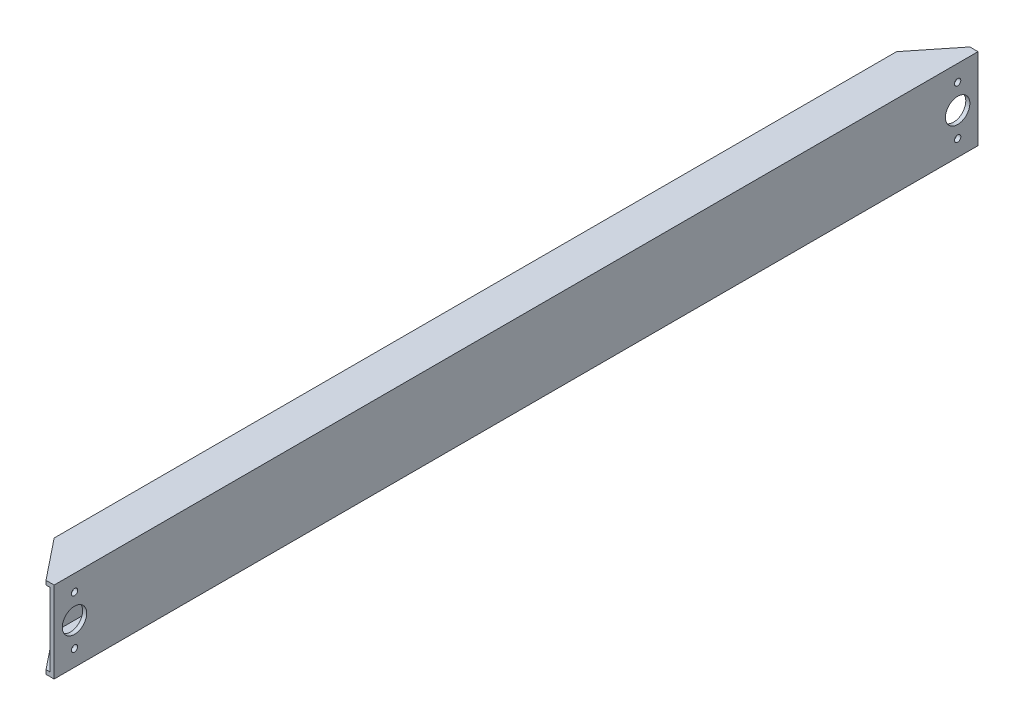
ISO-10303-21;
HEADER;
FILE_DESCRIPTION(('STEP AP214'),'2;1');
FILE_NAME('part.step','',(''),(''),'','','');
FILE_SCHEMA(('AUTOMOTIVE_DESIGN { 1 0 10303 214 1 1 1 1 }'));
ENDSEC;
DATA;
#1=APPLICATION_CONTEXT('core data for automotive mechanical design processes');
#2=APPLICATION_PROTOCOL_DEFINITION('international standard','automotive_design',2000,#1);
#3=PRODUCT_CONTEXT('',#1,'mechanical');
#4=PRODUCT('Part','Part','',(#3));
#5=PRODUCT_RELATED_PRODUCT_CATEGORY('part','',(#4));
#6=PRODUCT_DEFINITION_FORMATION('','',#4);
#7=PRODUCT_DEFINITION_CONTEXT('part definition',#1,'design');
#8=PRODUCT_DEFINITION('design','',#6,#7);
#9=PRODUCT_DEFINITION_SHAPE('','',#8);
#10=(LENGTH_UNIT() NAMED_UNIT(*) SI_UNIT(.MILLI.,.METRE.));
#11=(NAMED_UNIT(*) PLANE_ANGLE_UNIT() SI_UNIT($,.RADIAN.));
#12=(NAMED_UNIT(*) SI_UNIT($,.STERADIAN.) SOLID_ANGLE_UNIT());
#13=UNCERTAINTY_MEASURE_WITH_UNIT(LENGTH_MEASURE(1.E-05),#10,'distance_accuracy_value','');
#14=(GEOMETRIC_REPRESENTATION_CONTEXT(3) GLOBAL_UNCERTAINTY_ASSIGNED_CONTEXT((#13)) GLOBAL_UNIT_ASSIGNED_CONTEXT((#10,
#11,#12)) REPRESENTATION_CONTEXT('',''));
#15=CARTESIAN_POINT('',(0.,0.,0.));
#16=DIRECTION('',(0.,0.,1.));
#17=DIRECTION('',(1.,0.,0.));
#18=AXIS2_PLACEMENT_3D('',#15,#16,#17);
#19=CARTESIAN_POINT('',(0.,0.,0.));
#20=DIRECTION('',(0.,0.,1.));
#21=DIRECTION('',(1.,0.,0.));
#22=AXIS2_PLACEMENT_3D('',#19,#20,#21);
#23=PLANE('',#22);
#24=DIRECTION('',(0.,1.,0.));
#25=VECTOR('',#24,1.);
#26=CARTESIAN_POINT('',(13.2352727193805,-101.649519117322,0.));
#27=LINE('',#26,#25);
#28=CARTESIAN_POINT('',(13.2352727193805,-0.664680209622838,0.));
#29=VERTEX_POINT('',#28);
#30=CARTESIAN_POINT('',(13.2352727193805,2.51031979037716,0.));
#31=VERTEX_POINT('',#30);
#32=EDGE_CURVE('E57',#29,#31,#27,.T.);
#33=ORIENTED_EDGE('',*,*,#32,.T.);
#34=DIRECTION('',(-1.,0.,0.));
#35=VECTOR('',#34,1.);
#36=CARTESIAN_POINT('',(-12.1647272806195,2.51031979037716,0.));
#37=LINE('',#36,#35);
#38=CARTESIAN_POINT('',(19.5852727193805,2.51031979037716,0.));
#39=VERTEX_POINT('',#38);
#40=EDGE_CURVE('E157',#39,#31,#37,.T.);
#41=ORIENTED_EDGE('',*,*,#40,.F.);
#42=DIRECTION('',(0.,1.,0.));
#43=VECTOR('',#42,1.);
#44=CARTESIAN_POINT('',(19.5852727193805,2.51031979037716,0.));
#45=LINE('',#44,#43);
#46=CARTESIAN_POINT('',(19.5852727193805,-60.9896802096228,0.));
#47=VERTEX_POINT('',#46);
#48=EDGE_CURVE('E154',#47,#39,#45,.T.);
#49=ORIENTED_EDGE('',*,*,#48,.F.);
#50=DIRECTION('',(1.,0.,0.));
#51=VECTOR('',#50,1.);
#52=CARTESIAN_POINT('',(-12.1647272806195,-60.9896802096228,0.));
#53=LINE('',#52,#51);
#54=CARTESIAN_POINT('',(13.2352727193805,-60.9896802096228,0.));
#55=VERTEX_POINT('',#54);
#56=EDGE_CURVE('E152',#55,#47,#53,.T.);
#57=ORIENTED_EDGE('',*,*,#56,.F.);
#58=CARTESIAN_POINT('',(13.2352727193805,-57.8146802096229,0.));
#59=VERTEX_POINT('',#58);
#60=EDGE_CURVE('E206',#55,#59,#27,.T.);
#61=ORIENTED_EDGE('',*,*,#60,.T.);
#62=DIRECTION('',(1.,0.,0.));
#63=VECTOR('',#62,1.);
#64=CARTESIAN_POINT('',(-8.98972728061951,-57.8146802096228,0.));
#65=LINE('',#64,#63);
#66=CARTESIAN_POINT('',(16.4102727193805,-57.8146802096228,0.));
#67=VERTEX_POINT('',#66);
#68=EDGE_CURVE('E183',#59,#67,#65,.T.);
#69=ORIENTED_EDGE('',*,*,#68,.T.);
#70=DIRECTION('',(0.,1.,0.));
#71=VECTOR('',#70,1.);
#72=CARTESIAN_POINT('',(16.4102727193805,-0.664680209622838,0.));
#73=LINE('',#72,#71);
#74=CARTESIAN_POINT('',(16.4102727193805,-0.664680209622838,0.));
#75=VERTEX_POINT('',#74);
#76=EDGE_CURVE('E178',#67,#75,#73,.T.);
#77=ORIENTED_EDGE('',*,*,#76,.T.);
#78=DIRECTION('',(-1.,0.,0.));
#79=VECTOR('',#78,1.);
#80=CARTESIAN_POINT('',(-8.98972728061951,-0.664680209622838,0.));
#81=LINE('',#80,#79);
#82=EDGE_CURVE('E169',#75,#29,#81,.T.);
#83=ORIENTED_EDGE('',*,*,#82,.T.);
#84=EDGE_LOOP('',(#33,#41,#49,#57,#61,#69,#77,#83));
#85=FACE_BOUND('',#84,.T.);
#86=ADVANCED_FACE('F35',(#85),#23,.F.);
#87=CARTESIAN_POINT('',(-12.1647272806195,2.51031979037716,720.4964));
#88=DIRECTION('',(1.,0.,0.));
#89=DIRECTION('',(0.,1.,0.));
#90=AXIS2_PLACEMENT_3D('',#87,#88,#89);
#91=PLANE('',#90);
#92=DIRECTION('',(0.,0.,-1.));
#93=VECTOR('',#92,1.);
#94=CARTESIAN_POINT('',(-12.1647272806195,-60.9896802096228,720.4964));
#95=LINE('',#94,#93);
#96=CARTESIAN_POINT('',(-12.1647272806195,-60.9896802096229,688.7464));
#97=VERTEX_POINT('',#96);
#98=CARTESIAN_POINT('',(-12.1647272806195,-60.9896802096228,31.75));
#99=VERTEX_POINT('',#98);
#100=EDGE_CURVE('E164',#97,#99,#95,.T.);
#101=ORIENTED_EDGE('',*,*,#100,.F.);
#102=DIRECTION('',(0.,1.,0.));
#103=VECTOR('',#102,1.);
#104=CARTESIAN_POINT('',(-12.1647272806195,-101.649519117322,688.7464));
#105=LINE('',#104,#103);
#106=CARTESIAN_POINT('',(-12.1647272806195,2.51031979037716,688.7464));
#107=VERTEX_POINT('',#106);
#108=EDGE_CURVE('E238',#97,#107,#105,.T.);
#109=ORIENTED_EDGE('',*,*,#108,.T.);
#110=DIRECTION('',(0.,0.,-1.));
#111=VECTOR('',#110,1.);
#112=CARTESIAN_POINT('',(-12.1647272806195,2.51031979037716,720.4964));
#113=LINE('',#112,#111);
#114=CARTESIAN_POINT('',(-12.1647272806195,2.51031979037716,31.75));
#115=VERTEX_POINT('',#114);
#116=EDGE_CURVE('E136',#107,#115,#113,.T.);
#117=ORIENTED_EDGE('',*,*,#116,.T.);
#118=DIRECTION('',(0.,1.,0.));
#119=VECTOR('',#118,1.);
#120=CARTESIAN_POINT('',(-12.1647272806195,-101.649519117322,31.75));
#121=LINE('',#120,#119);
#122=EDGE_CURVE('E209',#99,#115,#121,.T.);
#123=ORIENTED_EDGE('',*,*,#122,.F.);
#124=EDGE_LOOP('',(#101,#109,#117,#123));
#125=FACE_BOUND('',#124,.T.);
#126=ADVANCED_FACE('F37',(#125),#91,.F.);
#127=CARTESIAN_POINT('',(-12.1647272806195,-60.9896802096228,720.4964));
#128=DIRECTION('',(0.,1.,0.));
#129=DIRECTION('',(0.,0.,1.));
#130=AXIS2_PLACEMENT_3D('',#127,#128,#129);
#131=PLANE('',#130);
#132=DIRECTION('',(1.,0.,0.));
#133=VECTOR('',#132,1.);
#134=CARTESIAN_POINT('',(-12.1647272806195,-60.9896802096228,720.4964));
#135=LINE('',#134,#133);
#136=CARTESIAN_POINT('',(13.2352727193806,-60.9896802096228,720.4964));
#137=VERTEX_POINT('',#136);
#138=CARTESIAN_POINT('',(19.5852727193805,-60.9896802096228,720.4964));
#139=VERTEX_POINT('',#138);
#140=EDGE_CURVE('E148',#137,#139,#135,.T.);
#141=ORIENTED_EDGE('',*,*,#140,.F.);
#142=DIRECTION('',(0.624695047554424,0.,0.780868809443031));
#143=VECTOR('',#142,1.);
#144=CARTESIAN_POINT('',(-343.391370293061,-60.9896802096228,274.713096234448));
#145=LINE('',#144,#143);
#146=EDGE_CURVE('E236',#97,#137,#145,.T.);
#147=ORIENTED_EDGE('',*,*,#146,.F.);
#148=ORIENTED_EDGE('',*,*,#100,.T.);
#149=DIRECTION('',(0.624695047554424,0.,-0.78086880944303));
#150=VECTOR('',#149,1.);
#151=CARTESIAN_POINT('',(8.07028824352469,-60.9896802096228,6.45623059481975));
#152=LINE('',#151,#150);
#153=EDGE_CURVE('E224',#99,#55,#152,.T.);
#154=ORIENTED_EDGE('',*,*,#153,.T.);
#155=ORIENTED_EDGE('',*,*,#56,.T.);
#156=DIRECTION('',(0.,0.,-1.));
#157=VECTOR('',#156,1.);
#158=CARTESIAN_POINT('',(19.5852727193805,-60.9896802096228,720.4964));
#159=LINE('',#158,#157);
#160=EDGE_CURVE('E161',#139,#47,#159,.T.);
#161=ORIENTED_EDGE('',*,*,#160,.F.);
#162=EDGE_LOOP('',(#141,#147,#148,#154,#155,#161));
#163=FACE_BOUND('',#162,.T.);
#164=ADVANCED_FACE('F199',(#163),#131,.F.);
#165=CARTESIAN_POINT('',(-12.1647272806195,2.51031979037716,720.4964));
#166=DIRECTION('',(0.,-1.,0.));
#167=DIRECTION('',(1.,0.,0.));
#168=AXIS2_PLACEMENT_3D('',#165,#166,#167);
#169=PLANE('',#168);
#170=ORIENTED_EDGE('',*,*,#116,.F.);
#171=DIRECTION('',(-0.624695047554424,0.,-0.780868809443031));
#172=VECTOR('',#171,1.);
#173=CARTESIAN_POINT('',(-343.391370293061,2.51031979037716,274.713096234448));
#174=LINE('',#173,#172);
#175=CARTESIAN_POINT('',(13.2352727193806,2.51031979037716,720.4964));
#176=VERTEX_POINT('',#175);
#177=EDGE_CURVE('E123',#176,#107,#174,.T.);
#178=ORIENTED_EDGE('',*,*,#177,.F.);
#179=DIRECTION('',(-1.,0.,0.));
#180=VECTOR('',#179,1.);
#181=CARTESIAN_POINT('',(-12.1647272806195,2.51031979037716,720.4964));
#182=LINE('',#181,#180);
#183=CARTESIAN_POINT('',(19.5852727193805,2.51031979037716,720.4964));
#184=VERTEX_POINT('',#183);
#185=EDGE_CURVE('E134',#184,#176,#182,.T.);
#186=ORIENTED_EDGE('',*,*,#185,.F.);
#187=DIRECTION('',(0.,0.,-1.));
#188=VECTOR('',#187,1.);
#189=CARTESIAN_POINT('',(19.5852727193805,2.51031979037716,720.4964));
#190=LINE('',#189,#188);
#191=EDGE_CURVE('E146',#184,#39,#190,.T.);
#192=ORIENTED_EDGE('',*,*,#191,.T.);
#193=ORIENTED_EDGE('',*,*,#40,.T.);
#194=DIRECTION('',(-0.624695047554424,0.,0.78086880944303));
#195=VECTOR('',#194,1.);
#196=CARTESIAN_POINT('',(8.07028824352469,2.51031979037716,6.45623059481975));
#197=LINE('',#196,#195);
#198=EDGE_CURVE('E228',#31,#115,#197,.T.);
#199=ORIENTED_EDGE('',*,*,#198,.T.);
#200=EDGE_LOOP('',(#170,#178,#186,#192,#193,#199));
#201=FACE_BOUND('',#200,.T.);
#202=ADVANCED_FACE('F132',(#201),#169,.F.);
#203=CARTESIAN_POINT('',(-8.98972728061951,-0.664680209622838,720.4964));
#204=DIRECTION('',(1.,0.,0.));
#205=DIRECTION('',(0.,1.,0.));
#206=AXIS2_PLACEMENT_3D('',#203,#204,#205);
#207=PLANE('',#206);
#208=DIRECTION('',(0.,1.,0.));
#209=VECTOR('',#208,1.);
#210=CARTESIAN_POINT('',(-8.98972728061951,-0.664680209622839,692.71515));
#211=LINE('',#210,#209);
#212=CARTESIAN_POINT('',(-8.98972728061951,-57.8146802096228,692.71515));
#213=VERTEX_POINT('',#212);
#214=CARTESIAN_POINT('',(-8.98972728061951,-0.664680209622838,692.71515));
#215=VERTEX_POINT('',#214);
#216=EDGE_CURVE('E233',#213,#215,#211,.T.);
#217=ORIENTED_EDGE('',*,*,#216,.F.);
#218=DIRECTION('',(0.,0.,-1.));
#219=VECTOR('',#218,1.);
#220=CARTESIAN_POINT('',(-8.98972728061951,-57.8146802096228,720.4964));
#221=LINE('',#220,#219);
#222=CARTESIAN_POINT('',(-8.98972728061951,-57.8146802096228,27.78125));
#223=VERTEX_POINT('',#222);
#224=EDGE_CURVE('E155',#213,#223,#221,.T.);
#225=ORIENTED_EDGE('',*,*,#224,.T.);
#226=DIRECTION('',(0.,1.,0.));
#227=VECTOR('',#226,1.);
#228=CARTESIAN_POINT('',(-8.98972728061951,-0.664680209622797,27.78125));
#229=LINE('',#228,#227);
#230=CARTESIAN_POINT('',(-8.98972728061953,-0.664680209622838,27.7812499999999));
#231=VERTEX_POINT('',#230);
#232=EDGE_CURVE('E218',#223,#231,#229,.T.);
#233=ORIENTED_EDGE('',*,*,#232,.T.);
#234=DIRECTION('',(0.,0.,-1.));
#235=VECTOR('',#234,1.);
#236=CARTESIAN_POINT('',(-8.98972728061951,-0.664680209622838,720.4964));
#237=LINE('',#236,#235);
#238=EDGE_CURVE('E172',#215,#231,#237,.T.);
#239=ORIENTED_EDGE('',*,*,#238,.F.);
#240=EDGE_LOOP('',(#217,#225,#233,#239));
#241=FACE_BOUND('',#240,.T.);
#242=ADVANCED_FACE('F304',(#241),#207,.T.);
#243=CARTESIAN_POINT('',(-8.98972728061951,-57.8146802096228,720.4964));
#244=DIRECTION('',(0.,1.,0.));
#245=DIRECTION('',(0.,0.,1.));
#246=AXIS2_PLACEMENT_3D('',#243,#244,#245);
#247=PLANE('',#246);
#248=DIRECTION('',(-0.624695047554424,0.,-0.780868809443031));
#249=VECTOR('',#248,1.);
#250=CARTESIAN_POINT('',(4.56210198767325,-57.8146802096228,709.654936585366));
#251=LINE('',#250,#249);
#252=CARTESIAN_POINT('',(13.2352727193806,-57.8146802096229,720.4964));
#253=VERTEX_POINT('',#252);
#254=EDGE_CURVE('E230',#253,#213,#251,.T.);
#255=ORIENTED_EDGE('',*,*,#254,.F.);
#256=DIRECTION('',(1.,0.,0.));
#257=VECTOR('',#256,1.);
#258=CARTESIAN_POINT('',(-8.98972728061951,-57.8146802096228,720.4964));
#259=LINE('',#258,#257);
#260=CARTESIAN_POINT('',(16.4102727193805,-57.8146802096228,720.4964));
#261=VERTEX_POINT('',#260);
#262=EDGE_CURVE('E179',#253,#261,#259,.T.);
#263=ORIENTED_EDGE('',*,*,#262,.T.);
#264=DIRECTION('',(0.,0.,-1.));
#265=VECTOR('',#264,1.);
#266=CARTESIAN_POINT('',(16.4102727193805,-57.8146802096228,720.4964));
#267=LINE('',#266,#265);
#268=EDGE_CURVE('E191',#261,#67,#267,.T.);
#269=ORIENTED_EDGE('',*,*,#268,.T.);
#270=ORIENTED_EDGE('',*,*,#68,.F.);
#271=DIRECTION('',(-0.624695047554424,0.,0.78086880944303));
#272=VECTOR('',#271,1.);
#273=CARTESIAN_POINT('',(-346.899556548912,-57.8146802096228,450.168536585366));
#274=LINE('',#273,#272);
#275=EDGE_CURVE('E216',#59,#223,#274,.T.);
#276=ORIENTED_EDGE('',*,*,#275,.T.);
#277=ORIENTED_EDGE('',*,*,#224,.F.);
#278=EDGE_LOOP('',(#255,#263,#269,#270,#276,#277));
#279=FACE_BOUND('',#278,.T.);
#280=ADVANCED_FACE('F214',(#279),#247,.T.);
#281=CARTESIAN_POINT('',(-8.98972728061951,-0.664680209622838,720.4964));
#282=DIRECTION('',(0.,-1.,0.));
#283=DIRECTION('',(0.,0.,-1.));
#284=AXIS2_PLACEMENT_3D('',#281,#282,#283);
#285=PLANE('',#284);
#286=DIRECTION('',(0.624695047554424,0.,0.780868809443031));
#287=VECTOR('',#286,1.);
#288=CARTESIAN_POINT('',(4.56210198767324,-0.664680209622838,709.654936585366));
#289=LINE('',#288,#287);
#290=CARTESIAN_POINT('',(13.2352727193805,-0.664680209622838,720.4964));
#291=VERTEX_POINT('',#290);
#292=EDGE_CURVE('E49',#215,#291,#289,.T.);
#293=ORIENTED_EDGE('',*,*,#292,.F.);
#294=ORIENTED_EDGE('',*,*,#238,.T.);
#295=DIRECTION('',(0.624695047554424,0.,-0.78086880944303));
#296=VECTOR('',#295,1.);
#297=CARTESIAN_POINT('',(-346.899556548912,-0.664680209622838,450.168536585366));
#298=LINE('',#297,#296);
#299=EDGE_CURVE('E43',#231,#29,#298,.T.);
#300=ORIENTED_EDGE('',*,*,#299,.T.);
#301=ORIENTED_EDGE('',*,*,#82,.F.);
#302=DIRECTION('',(0.,0.,-1.));
#303=VECTOR('',#302,1.);
#304=CARTESIAN_POINT('',(16.4102727193805,-0.664680209622838,720.4964));
#305=LINE('',#304,#303);
#306=CARTESIAN_POINT('',(16.4102727193805,-0.664680209622838,720.4964));
#307=VERTEX_POINT('',#306);
#308=EDGE_CURVE('E188',#307,#75,#305,.T.);
#309=ORIENTED_EDGE('',*,*,#308,.F.);
#310=DIRECTION('',(-1.,0.,0.));
#311=VECTOR('',#310,1.);
#312=CARTESIAN_POINT('',(-8.98972728061951,-0.664680209622838,720.4964));
#313=LINE('',#312,#311);
#314=EDGE_CURVE('E189',#307,#291,#313,.T.);
#315=ORIENTED_EDGE('',*,*,#314,.T.);
#316=EDGE_LOOP('',(#293,#294,#300,#301,#309,#315));
#317=FACE_BOUND('',#316,.T.);
#318=ADVANCED_FACE('F168',(#317),#285,.T.);
#319=CARTESIAN_POINT('',(0.,0.,720.4964));
#320=DIRECTION('',(0.,0.,1.));
#321=DIRECTION('',(1.,0.,0.));
#322=AXIS2_PLACEMENT_3D('',#319,#320,#321);
#323=PLANE('',#322);
#324=DIRECTION('',(0.,1.,0.));
#325=VECTOR('',#324,1.);
#326=CARTESIAN_POINT('',(13.2352727193806,-101.649519117322,720.4964));
#327=LINE('',#326,#325);
#328=EDGE_CURVE('E137',#137,#253,#327,.T.);
#329=ORIENTED_EDGE('',*,*,#328,.F.);
#330=ORIENTED_EDGE('',*,*,#140,.T.);
#331=DIRECTION('',(0.,1.,0.));
#332=VECTOR('',#331,1.);
#333=CARTESIAN_POINT('',(19.5852727193805,2.51031979037716,720.4964));
#334=LINE('',#333,#332);
#335=EDGE_CURVE('E143',#139,#184,#334,.T.);
#336=ORIENTED_EDGE('',*,*,#335,.T.);
#337=ORIENTED_EDGE('',*,*,#185,.T.);
#338=DIRECTION('',(0.,1.,0.));
#339=VECTOR('',#338,1.);
#340=CARTESIAN_POINT('',(13.2352727193805,0.,720.4964));
#341=LINE('',#340,#339);
#342=EDGE_CURVE('E11',#291,#176,#341,.T.);
#343=ORIENTED_EDGE('',*,*,#342,.F.);
#344=ORIENTED_EDGE('',*,*,#314,.F.);
#345=DIRECTION('',(0.,1.,0.));
#346=VECTOR('',#345,1.);
#347=CARTESIAN_POINT('',(16.4102727193805,-0.664680209622838,720.4964));
#348=LINE('',#347,#346);
#349=EDGE_CURVE('E181',#261,#307,#348,.T.);
#350=ORIENTED_EDGE('',*,*,#349,.F.);
#351=ORIENTED_EDGE('',*,*,#262,.F.);
#352=EDGE_LOOP('',(#329,#330,#336,#337,#343,#344,#350,#351));
#353=FACE_BOUND('',#352,.T.);
#354=ADVANCED_FACE('F141',(#353),#323,.T.);
#355=CARTESIAN_POINT('',(19.5852727193805,2.51031979037716,720.4964));
#356=DIRECTION('',(-1.,0.,0.));
#357=DIRECTION('',(0.,-1.,0.));
#358=AXIS2_PLACEMENT_3D('',#355,#356,#357);
#359=PLANE('',#358);
#360=CARTESIAN_POINT('',(19.5852727193805,-29.2396802096228,704.6214));
#361=DIRECTION('',(-1.,0.,0.));
#362=DIRECTION('',(0.,-1.,0.));
#363=AXIS2_PLACEMENT_3D('',#360,#361,#362);
#364=CIRCLE('',#363,9.52500000000002);
#365=CARTESIAN_POINT('',(19.5852727193805,-38.7646802096228,704.6214));
#366=VERTEX_POINT('',#365);
#367=EDGE_CURVE('E273',#366,#366,#364,.T.);
#368=ORIENTED_EDGE('',*,*,#367,.T.);
#369=EDGE_LOOP('',(#368));
#370=FACE_BOUND('',#369,.T.);
#371=CARTESIAN_POINT('',(19.5852727193805,-29.2396802096228,15.875));
#372=DIRECTION('',(-1.,0.,0.));
#373=DIRECTION('',(0.,-1.,0.));
#374=AXIS2_PLACEMENT_3D('',#371,#372,#373);
#375=CIRCLE('',#374,9.525);
#376=CARTESIAN_POINT('',(19.5852727193805,-38.7646802096228,15.875));
#377=VERTEX_POINT('',#376);
#378=EDGE_CURVE('E264',#377,#377,#375,.F.);
#379=ORIENTED_EDGE('',*,*,#378,.F.);
#380=EDGE_LOOP('',(#379));
#381=FACE_BOUND('',#380,.T.);
#382=CARTESIAN_POINT('',(19.5852727193805,-10.1896802096229,15.875));
#383=DIRECTION('',(-1.,0.,0.));
#384=DIRECTION('',(0.,0.,1.));
#385=AXIS2_PLACEMENT_3D('',#382,#383,#384);
#386=CIRCLE('',#385,2.45745);
#387=CARTESIAN_POINT('',(19.5852727193805,-10.1896802096229,18.33245));
#388=VERTEX_POINT('',#387);
#389=EDGE_CURVE('E258',#388,#388,#386,.T.);
#390=ORIENTED_EDGE('',*,*,#389,.T.);
#391=EDGE_LOOP('',(#390));
#392=FACE_BOUND('',#391,.T.);
#393=CARTESIAN_POINT('',(19.5852727193805,-48.2896802096228,15.875));
#394=DIRECTION('',(-1.,0.,0.));
#395=DIRECTION('',(0.,0.,1.));
#396=AXIS2_PLACEMENT_3D('',#393,#394,#395);
#397=CIRCLE('',#396,2.45745);
#398=CARTESIAN_POINT('',(19.5852727193805,-48.2896802096228,18.33245));
#399=VERTEX_POINT('',#398);
#400=EDGE_CURVE('E252',#399,#399,#397,.T.);
#401=ORIENTED_EDGE('',*,*,#400,.T.);
#402=EDGE_LOOP('',(#401));
#403=FACE_BOUND('',#402,.T.);
#404=CARTESIAN_POINT('',(19.5852727193805,-10.1896802096228,704.6214));
#405=DIRECTION('',(-1.,0.,0.));
#406=DIRECTION('',(0.,0.,1.));
#407=AXIS2_PLACEMENT_3D('',#404,#405,#406);
#408=CIRCLE('',#407,2.45745);
#409=CARTESIAN_POINT('',(19.5852727193805,-10.1896802096228,707.07885));
#410=VERTEX_POINT('',#409);
#411=EDGE_CURVE('E246',#410,#410,#408,.T.);
#412=ORIENTED_EDGE('',*,*,#411,.T.);
#413=EDGE_LOOP('',(#412));
#414=FACE_BOUND('',#413,.T.);
#415=CARTESIAN_POINT('',(19.5852727193805,-48.2896802096229,704.6214));
#416=DIRECTION('',(-1.,0.,0.));
#417=DIRECTION('',(0.,0.,1.));
#418=AXIS2_PLACEMENT_3D('',#415,#416,#417);
#419=CIRCLE('',#418,2.45745);
#420=CARTESIAN_POINT('',(19.5852727193805,-48.2896802096229,707.07885));
#421=VERTEX_POINT('',#420);
#422=EDGE_CURVE('E138',#421,#421,#419,.T.);
#423=ORIENTED_EDGE('',*,*,#422,.T.);
#424=EDGE_LOOP('',(#423));
#425=FACE_BOUND('',#424,.T.);
#426=ORIENTED_EDGE('',*,*,#48,.T.);
#427=ORIENTED_EDGE('',*,*,#191,.F.);
#428=ORIENTED_EDGE('',*,*,#335,.F.);
#429=ORIENTED_EDGE('',*,*,#160,.T.);
#430=EDGE_LOOP('',(#426,#427,#428,#429));
#431=FACE_BOUND('',#430,.T.);
#432=ADVANCED_FACE('F204',(#370,#381,#392,#403,#414,#425,#431),#359,.F.);
#433=CARTESIAN_POINT('',(16.4102727193805,-0.664680209622838,720.4964));
#434=DIRECTION('',(-1.,0.,0.));
#435=DIRECTION('',(0.,-1.,0.));
#436=AXIS2_PLACEMENT_3D('',#433,#434,#435);
#437=PLANE('',#436);
#438=CARTESIAN_POINT('',(16.4102727193805,-29.2396802096228,704.6214));
#439=DIRECTION('',(1.,0.,0.));
#440=DIRECTION('',(0.,1.,0.));
#441=AXIS2_PLACEMENT_3D('',#438,#439,#440);
#442=CIRCLE('',#441,9.52500000000002);
#443=CARTESIAN_POINT('',(16.4102727193805,-19.7146802096227,704.6214));
#444=VERTEX_POINT('',#443);
#445=EDGE_CURVE('E270',#444,#444,#442,.T.);
#446=ORIENTED_EDGE('',*,*,#445,.T.);
#447=EDGE_LOOP('',(#446));
#448=FACE_BOUND('',#447,.T.);
#449=CARTESIAN_POINT('',(16.4102727193805,-29.2396802096228,15.875));
#450=DIRECTION('',(-1.,0.,0.));
#451=DIRECTION('',(0.,-1.,0.));
#452=AXIS2_PLACEMENT_3D('',#449,#450,#451);
#453=CIRCLE('',#452,9.525);
#454=CARTESIAN_POINT('',(16.4102727193805,-38.7646802096228,15.875));
#455=VERTEX_POINT('',#454);
#456=EDGE_CURVE('E267',#455,#455,#453,.T.);
#457=ORIENTED_EDGE('',*,*,#456,.F.);
#458=EDGE_LOOP('',(#457));
#459=FACE_BOUND('',#458,.T.);
#460=CARTESIAN_POINT('',(16.4102727193805,-10.1896802096229,15.875));
#461=DIRECTION('',(-1.,0.,0.));
#462=DIRECTION('',(0.,0.,1.));
#463=AXIS2_PLACEMENT_3D('',#460,#461,#462);
#464=CIRCLE('',#463,2.45744999999999);
#465=CARTESIAN_POINT('',(16.4102727193805,-10.1896802096229,18.33245));
#466=VERTEX_POINT('',#465);
#467=EDGE_CURVE('E261',#466,#466,#464,.T.);
#468=ORIENTED_EDGE('',*,*,#467,.F.);
#469=EDGE_LOOP('',(#468));
#470=FACE_BOUND('',#469,.T.);
#471=CARTESIAN_POINT('',(16.4102727193805,-48.2896802096228,15.875));
#472=DIRECTION('',(-1.,0.,0.));
#473=DIRECTION('',(0.,0.,1.));
#474=AXIS2_PLACEMENT_3D('',#471,#472,#473);
#475=CIRCLE('',#474,2.45744999999999);
#476=CARTESIAN_POINT('',(16.4102727193805,-48.2896802096228,18.33245));
#477=VERTEX_POINT('',#476);
#478=EDGE_CURVE('E255',#477,#477,#475,.T.);
#479=ORIENTED_EDGE('',*,*,#478,.F.);
#480=EDGE_LOOP('',(#479));
#481=FACE_BOUND('',#480,.T.);
#482=CARTESIAN_POINT('',(16.4102727193805,-10.1896802096228,704.6214));
#483=DIRECTION('',(-1.,0.,0.));
#484=DIRECTION('',(0.,0.,1.));
#485=AXIS2_PLACEMENT_3D('',#482,#483,#484);
#486=CIRCLE('',#485,2.45744999999999);
#487=CARTESIAN_POINT('',(16.4102727193805,-10.1896802096228,707.07885));
#488=VERTEX_POINT('',#487);
#489=EDGE_CURVE('E249',#488,#488,#486,.T.);
#490=ORIENTED_EDGE('',*,*,#489,.F.);
#491=EDGE_LOOP('',(#490));
#492=FACE_BOUND('',#491,.T.);
#493=CARTESIAN_POINT('',(16.4102727193805,-48.2896802096229,704.6214));
#494=DIRECTION('',(-1.,0.,0.));
#495=DIRECTION('',(0.,0.,1.));
#496=AXIS2_PLACEMENT_3D('',#493,#494,#495);
#497=CIRCLE('',#496,2.45744999999999);
#498=CARTESIAN_POINT('',(16.4102727193805,-48.2896802096229,707.07885));
#499=VERTEX_POINT('',#498);
#500=EDGE_CURVE('E243',#499,#499,#497,.T.);
#501=ORIENTED_EDGE('',*,*,#500,.F.);
#502=EDGE_LOOP('',(#501));
#503=FACE_BOUND('',#502,.T.);
#504=ORIENTED_EDGE('',*,*,#76,.F.);
#505=ORIENTED_EDGE('',*,*,#268,.F.);
#506=ORIENTED_EDGE('',*,*,#349,.T.);
#507=ORIENTED_EDGE('',*,*,#308,.T.);
#508=EDGE_LOOP('',(#504,#505,#506,#507));
#509=FACE_BOUND('',#508,.T.);
#510=ADVANCED_FACE('F286',(#448,#459,#470,#481,#492,#503,#509),#437,.T.);
#511=CARTESIAN_POINT('',(8.07028824352469,-101.649519117322,6.45623059481975));
#512=DIRECTION('',(-0.78086880944303,0.,-0.624695047554424));
#513=DIRECTION('',(-0.624695047554424,0.,0.78086880944303));
#514=AXIS2_PLACEMENT_3D('',#511,#512,#513);
#515=PLANE('',#514);
#516=ORIENTED_EDGE('',*,*,#60,.F.);
#517=ORIENTED_EDGE('',*,*,#153,.F.);
#518=ORIENTED_EDGE('',*,*,#122,.T.);
#519=ORIENTED_EDGE('',*,*,#198,.F.);
#520=ORIENTED_EDGE('',*,*,#32,.F.);
#521=ORIENTED_EDGE('',*,*,#299,.F.);
#522=ORIENTED_EDGE('',*,*,#232,.F.);
#523=ORIENTED_EDGE('',*,*,#275,.F.);
#524=EDGE_LOOP('',(#516,#517,#518,#519,#520,#521,#522,#523));
#525=FACE_BOUND('',#524,.T.);
#526=ADVANCED_FACE('F289',(#525),#515,.T.);
#527=CARTESIAN_POINT('',(-343.391370293061,-101.649519117322,274.713096234448));
#528=DIRECTION('',(0.780868809443031,0.,-0.624695047554424));
#529=DIRECTION('',(-0.624695047554424,0.,-0.780868809443031));
#530=AXIS2_PLACEMENT_3D('',#527,#528,#529);
#531=PLANE('',#530);
#532=ORIENTED_EDGE('',*,*,#254,.T.);
#533=ORIENTED_EDGE('',*,*,#216,.T.);
#534=ORIENTED_EDGE('',*,*,#292,.T.);
#535=ORIENTED_EDGE('',*,*,#342,.T.);
#536=ORIENTED_EDGE('',*,*,#177,.T.);
#537=ORIENTED_EDGE('',*,*,#108,.F.);
#538=ORIENTED_EDGE('',*,*,#146,.T.);
#539=ORIENTED_EDGE('',*,*,#328,.T.);
#540=EDGE_LOOP('',(#532,#533,#534,#535,#536,#537,#538,#539));
#541=FACE_BOUND('',#540,.T.);
#542=ADVANCED_FACE('F122',(#541),#531,.F.);
#543=CARTESIAN_POINT('',(16.4102727193805,-48.2896802096229,704.6214));
#544=DIRECTION('',(-1.,0.,0.));
#545=DIRECTION('',(0.,0.,1.));
#546=AXIS2_PLACEMENT_3D('',#543,#544,#545);
#547=CYLINDRICAL_SURFACE('',#546,2.45744999999999);
#548=ORIENTED_EDGE('',*,*,#422,.F.);
#549=EDGE_LOOP('',(#548));
#550=FACE_BOUND('',#549,.T.);
#551=ORIENTED_EDGE('',*,*,#500,.T.);
#552=EDGE_LOOP('',(#551));
#553=FACE_BOUND('',#552,.T.);
#554=ADVANCED_FACE('F310',(#550,#553),#547,.F.);
#555=CARTESIAN_POINT('',(16.4102727193805,-10.1896802096228,704.6214));
#556=DIRECTION('',(-1.,0.,0.));
#557=DIRECTION('',(0.,0.,1.));
#558=AXIS2_PLACEMENT_3D('',#555,#556,#557);
#559=CYLINDRICAL_SURFACE('',#558,2.45744999999999);
#560=ORIENTED_EDGE('',*,*,#411,.F.);
#561=EDGE_LOOP('',(#560));
#562=FACE_BOUND('',#561,.T.);
#563=ORIENTED_EDGE('',*,*,#489,.T.);
#564=EDGE_LOOP('',(#563));
#565=FACE_BOUND('',#564,.T.);
#566=ADVANCED_FACE('F395',(#562,#565),#559,.F.);
#567=CARTESIAN_POINT('',(16.4102727193805,-48.2896802096228,15.875));
#568=DIRECTION('',(-1.,0.,0.));
#569=DIRECTION('',(0.,0.,1.));
#570=AXIS2_PLACEMENT_3D('',#567,#568,#569);
#571=CYLINDRICAL_SURFACE('',#570,2.45744999999999);
#572=ORIENTED_EDGE('',*,*,#400,.F.);
#573=EDGE_LOOP('',(#572));
#574=FACE_BOUND('',#573,.T.);
#575=ORIENTED_EDGE('',*,*,#478,.T.);
#576=EDGE_LOOP('',(#575));
#577=FACE_BOUND('',#576,.T.);
#578=ADVANCED_FACE('F388',(#574,#577),#571,.F.);
#579=CARTESIAN_POINT('',(16.4102727193805,-10.1896802096229,15.875));
#580=DIRECTION('',(-1.,0.,0.));
#581=DIRECTION('',(0.,0.,1.));
#582=AXIS2_PLACEMENT_3D('',#579,#580,#581);
#583=CYLINDRICAL_SURFACE('',#582,2.45744999999999);
#584=ORIENTED_EDGE('',*,*,#389,.F.);
#585=EDGE_LOOP('',(#584));
#586=FACE_BOUND('',#585,.T.);
#587=ORIENTED_EDGE('',*,*,#467,.T.);
#588=EDGE_LOOP('',(#587));
#589=FACE_BOUND('',#588,.T.);
#590=ADVANCED_FACE('F373',(#586,#589),#583,.F.);
#591=CARTESIAN_POINT('',(46.526041082588,-29.2396802096228,15.875));
#592=DIRECTION('',(-1.,0.,0.));
#593=DIRECTION('',(0.,-1.,0.));
#594=AXIS2_PLACEMENT_3D('',#591,#592,#593);
#595=CYLINDRICAL_SURFACE('',#594,9.525);
#596=ORIENTED_EDGE('',*,*,#378,.T.);
#597=EDGE_LOOP('',(#596));
#598=FACE_BOUND('',#597,.T.);
#599=ORIENTED_EDGE('',*,*,#456,.T.);
#600=EDGE_LOOP('',(#599));
#601=FACE_BOUND('',#600,.T.);
#602=ADVANCED_FACE('F282',(#598,#601),#595,.F.);
#603=CARTESIAN_POINT('',(46.526041082588,-29.2396802096227,704.6214));
#604=DIRECTION('',(-1.,0.,0.));
#605=DIRECTION('',(0.,-1.,0.));
#606=AXIS2_PLACEMENT_3D('',#603,#604,#605);
#607=CYLINDRICAL_SURFACE('',#606,9.52500000000002);
#608=ORIENTED_EDGE('',*,*,#367,.F.);
#609=EDGE_LOOP('',(#608));
#610=FACE_BOUND('',#609,.T.);
#611=ORIENTED_EDGE('',*,*,#445,.F.);
#612=EDGE_LOOP('',(#611));
#613=FACE_BOUND('',#612,.T.);
#614=ADVANCED_FACE('F279',(#610,#613),#607,.F.);
#615=CLOSED_SHELL('',(#86,#126,#164,#202,#242,#280,#318,#354,#432,#510,#526,#542,#554,#566,#578,
#590,#602,#614));
#616=MANIFOLD_SOLID_BREP('B2',#615);
#617=ADVANCED_BREP_SHAPE_REPRESENTATION('',(#18,#616),#14);
#618=SHAPE_DEFINITION_REPRESENTATION(#9,#617);
ENDSEC;
END-ISO-10303-21;
